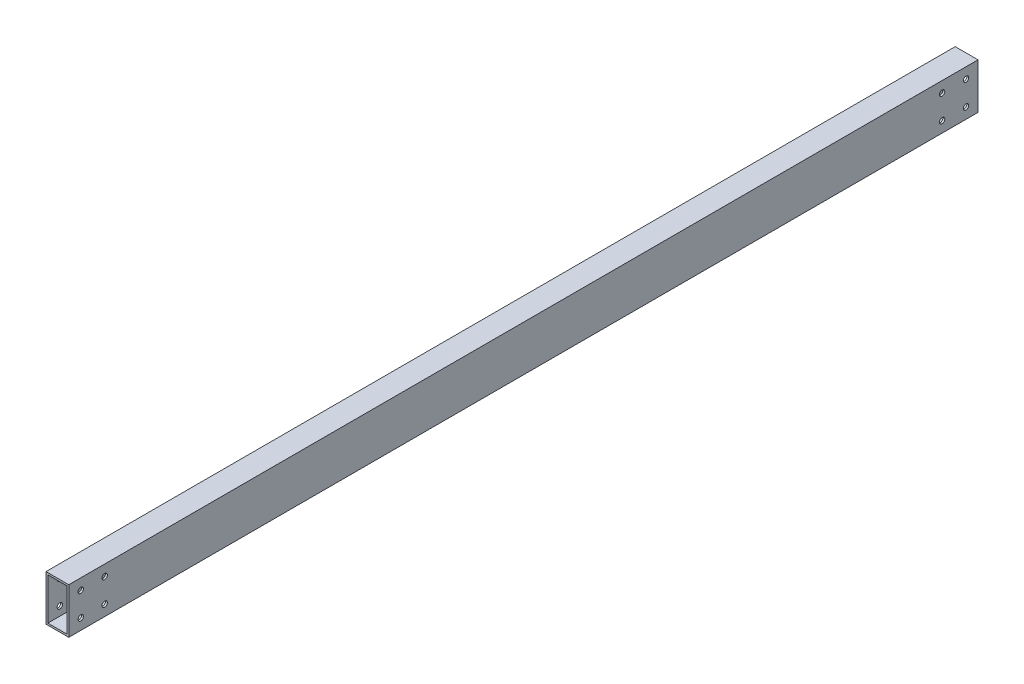
ISO-10303-21;
HEADER;
FILE_DESCRIPTION(('STEP AP214'),'2;1');
FILE_NAME('part.step','',(''),(''),'','','');
FILE_SCHEMA(('AUTOMOTIVE_DESIGN { 1 0 10303 214 1 1 1 1 }'));
ENDSEC;
DATA;
#1=APPLICATION_CONTEXT('core data for automotive mechanical design processes');
#2=APPLICATION_PROTOCOL_DEFINITION('international standard','automotive_design',2000,#1);
#3=PRODUCT_CONTEXT('',#1,'mechanical');
#4=PRODUCT('Part','Part','',(#3));
#5=PRODUCT_RELATED_PRODUCT_CATEGORY('part','',(#4));
#6=PRODUCT_DEFINITION_FORMATION('','',#4);
#7=PRODUCT_DEFINITION_CONTEXT('part definition',#1,'design');
#8=PRODUCT_DEFINITION('design','',#6,#7);
#9=PRODUCT_DEFINITION_SHAPE('','',#8);
#10=(LENGTH_UNIT() NAMED_UNIT(*) SI_UNIT(.MILLI.,.METRE.));
#11=(NAMED_UNIT(*) PLANE_ANGLE_UNIT() SI_UNIT($,.RADIAN.));
#12=(NAMED_UNIT(*) SI_UNIT($,.STERADIAN.) SOLID_ANGLE_UNIT());
#13=UNCERTAINTY_MEASURE_WITH_UNIT(LENGTH_MEASURE(1.E-05),#10,'distance_accuracy_value','');
#14=(GEOMETRIC_REPRESENTATION_CONTEXT(3) GLOBAL_UNCERTAINTY_ASSIGNED_CONTEXT((#13)) GLOBAL_UNIT_ASSIGNED_CONTEXT((#10,
#11,#12)) REPRESENTATION_CONTEXT('',''));
#15=CARTESIAN_POINT('',(0.,0.,0.));
#16=DIRECTION('',(0.,0.,1.));
#17=DIRECTION('',(1.,0.,0.));
#18=AXIS2_PLACEMENT_3D('',#15,#16,#17);
#19=CARTESIAN_POINT('',(19.05,38.1,760.));
#20=DIRECTION('',(-1.,0.,0.));
#21=DIRECTION('',(0.,-1.,0.));
#22=AXIS2_PLACEMENT_3D('',#19,#20,#21);
#23=PLANE('',#22);
#24=CARTESIAN_POINT('',(19.05,20.,-740.));
#25=DIRECTION('',(1.,0.,0.));
#26=DIRECTION('',(0.,0.,-1.));
#27=AXIS2_PLACEMENT_3D('',#24,#25,#26);
#28=CIRCLE('',#27,4.5);
#29=CARTESIAN_POINT('',(19.05,20.,-744.5));
#30=VERTEX_POINT('',#29);
#31=EDGE_CURVE('E252',#30,#30,#28,.T.);
#32=ORIENTED_EDGE('',*,*,#31,.F.);
#33=EDGE_LOOP('',(#32));
#34=FACE_BOUND('',#33,.T.);
#35=CARTESIAN_POINT('',(19.05,-20.,-700.));
#36=DIRECTION('',(1.,0.,0.));
#37=DIRECTION('',(0.,0.,-1.));
#38=AXIS2_PLACEMENT_3D('',#35,#36,#37);
#39=CIRCLE('',#38,4.5);
#40=CARTESIAN_POINT('',(19.05,-20.,-704.5));
#41=VERTEX_POINT('',#40);
#42=EDGE_CURVE('E256',#41,#41,#39,.T.);
#43=ORIENTED_EDGE('',*,*,#42,.F.);
#44=EDGE_LOOP('',(#43));
#45=FACE_BOUND('',#44,.T.);
#46=CARTESIAN_POINT('',(19.05,-20.,740.));
#47=DIRECTION('',(1.,0.,0.));
#48=DIRECTION('',(0.,0.,-1.));
#49=AXIS2_PLACEMENT_3D('',#46,#47,#48);
#50=CIRCLE('',#49,4.5);
#51=CARTESIAN_POINT('',(19.05,-20.,735.5));
#52=VERTEX_POINT('',#51);
#53=EDGE_CURVE('E260',#52,#52,#50,.T.);
#54=ORIENTED_EDGE('',*,*,#53,.F.);
#55=EDGE_LOOP('',(#54));
#56=FACE_BOUND('',#55,.T.);
#57=CARTESIAN_POINT('',(19.05,-20.,700.));
#58=DIRECTION('',(1.,0.,0.));
#59=DIRECTION('',(0.,0.,-1.));
#60=AXIS2_PLACEMENT_3D('',#57,#58,#59);
#61=CIRCLE('',#60,4.5);
#62=CARTESIAN_POINT('',(19.05,-20.,695.5));
#63=VERTEX_POINT('',#62);
#64=EDGE_CURVE('E263',#63,#63,#61,.T.);
#65=ORIENTED_EDGE('',*,*,#64,.F.);
#66=EDGE_LOOP('',(#65));
#67=FACE_BOUND('',#66,.T.);
#68=DIRECTION('',(0.,1.,0.));
#69=VECTOR('',#68,1.);
#70=CARTESIAN_POINT('',(19.05,38.1,-760.));
#71=LINE('',#70,#69);
#72=CARTESIAN_POINT('',(19.05,-38.1,-760.));
#73=VERTEX_POINT('',#72);
#74=CARTESIAN_POINT('',(19.05,38.1,-760.));
#75=VERTEX_POINT('',#74);
#76=EDGE_CURVE('E146',#73,#75,#71,.T.);
#77=ORIENTED_EDGE('',*,*,#76,.T.);
#78=DIRECTION('',(0.,0.,-1.));
#79=VECTOR('',#78,1.);
#80=CARTESIAN_POINT('',(19.05,38.1,760.));
#81=LINE('',#80,#79);
#82=CARTESIAN_POINT('',(19.05,38.1,760.));
#83=VERTEX_POINT('',#82);
#84=EDGE_CURVE('E12',#83,#75,#81,.T.);
#85=ORIENTED_EDGE('',*,*,#84,.F.);
#86=DIRECTION('',(0.,1.,0.));
#87=VECTOR('',#86,1.);
#88=CARTESIAN_POINT('',(19.05,38.1,760.));
#89=LINE('',#88,#87);
#90=CARTESIAN_POINT('',(19.05,-38.1,760.));
#91=VERTEX_POINT('',#90);
#92=EDGE_CURVE('E179',#91,#83,#89,.T.);
#93=ORIENTED_EDGE('',*,*,#92,.F.);
#94=DIRECTION('',(0.,0.,-1.));
#95=VECTOR('',#94,1.);
#96=CARTESIAN_POINT('',(19.05,-38.1,760.));
#97=LINE('',#96,#95);
#98=EDGE_CURVE('E193',#91,#73,#97,.T.);
#99=ORIENTED_EDGE('',*,*,#98,.T.);
#100=EDGE_LOOP('',(#77,#85,#93,#99));
#101=FACE_BOUND('',#100,.T.);
#102=CARTESIAN_POINT('',(19.05,20.,700.));
#103=DIRECTION('',(1.,0.,0.));
#104=DIRECTION('',(0.,0.,-1.));
#105=AXIS2_PLACEMENT_3D('',#102,#103,#104);
#106=CIRCLE('',#105,4.5);
#107=CARTESIAN_POINT('',(19.05,20.,695.5));
#108=VERTEX_POINT('',#107);
#109=EDGE_CURVE('E272',#108,#108,#106,.T.);
#110=ORIENTED_EDGE('',*,*,#109,.F.);
#111=EDGE_LOOP('',(#110));
#112=FACE_BOUND('',#111,.T.);
#113=CARTESIAN_POINT('',(19.05,20.,740.));
#114=DIRECTION('',(1.,0.,0.));
#115=DIRECTION('',(0.,0.,-1.));
#116=AXIS2_PLACEMENT_3D('',#113,#114,#115);
#117=CIRCLE('',#116,4.5);
#118=CARTESIAN_POINT('',(19.05,20.,735.5));
#119=VERTEX_POINT('',#118);
#120=EDGE_CURVE('E288',#119,#119,#117,.T.);
#121=ORIENTED_EDGE('',*,*,#120,.F.);
#122=EDGE_LOOP('',(#121));
#123=FACE_BOUND('',#122,.T.);
#124=CARTESIAN_POINT('',(19.05,20.,-700.));
#125=DIRECTION('',(1.,0.,0.));
#126=DIRECTION('',(0.,0.,-1.));
#127=AXIS2_PLACEMENT_3D('',#124,#125,#126);
#128=CIRCLE('',#127,4.5);
#129=CARTESIAN_POINT('',(19.05,20.,-704.5));
#130=VERTEX_POINT('',#129);
#131=EDGE_CURVE('E334',#130,#130,#128,.T.);
#132=ORIENTED_EDGE('',*,*,#131,.F.);
#133=EDGE_LOOP('',(#132));
#134=FACE_BOUND('',#133,.T.);
#135=CARTESIAN_POINT('',(19.05,-20.,-740.));
#136=DIRECTION('',(1.,0.,0.));
#137=DIRECTION('',(0.,0.,-1.));
#138=AXIS2_PLACEMENT_3D('',#135,#136,#137);
#139=CIRCLE('',#138,4.5);
#140=CARTESIAN_POINT('',(19.05,-20.,-744.5));
#141=VERTEX_POINT('',#140);
#142=EDGE_CURVE('E342',#141,#141,#139,.T.);
#143=ORIENTED_EDGE('',*,*,#142,.F.);
#144=EDGE_LOOP('',(#143));
#145=FACE_BOUND('',#144,.T.);
#146=ADVANCED_FACE('F63',(#34,#45,#56,#67,#101,#112,#123,#134,#145),#23,.F.);
#147=CARTESIAN_POINT('',(0.,0.,760.));
#148=DIRECTION('',(0.,0.,1.));
#149=DIRECTION('',(1.,0.,0.));
#150=AXIS2_PLACEMENT_3D('',#147,#148,#149);
#151=PLANE('',#150);
#152=ORIENTED_EDGE('',*,*,#92,.T.);
#153=DIRECTION('',(-1.,0.,0.));
#154=VECTOR('',#153,1.);
#155=CARTESIAN_POINT('',(-19.05,38.1,760.));
#156=LINE('',#155,#154);
#157=CARTESIAN_POINT('',(-19.05,38.1,760.));
#158=VERTEX_POINT('',#157);
#159=EDGE_CURVE('E183',#83,#158,#156,.T.);
#160=ORIENTED_EDGE('',*,*,#159,.T.);
#161=DIRECTION('',(0.,-1.,0.));
#162=VECTOR('',#161,1.);
#163=CARTESIAN_POINT('',(-19.05,38.1,760.));
#164=LINE('',#163,#162);
#165=CARTESIAN_POINT('',(-19.05,-38.1,760.));
#166=VERTEX_POINT('',#165);
#167=EDGE_CURVE('E187',#158,#166,#164,.T.);
#168=ORIENTED_EDGE('',*,*,#167,.T.);
#169=DIRECTION('',(1.,0.,0.));
#170=VECTOR('',#169,1.);
#171=CARTESIAN_POINT('',(-19.05,-38.1,760.));
#172=LINE('',#171,#170);
#173=EDGE_CURVE('E190',#166,#91,#172,.T.);
#174=ORIENTED_EDGE('',*,*,#173,.T.);
#175=EDGE_LOOP('',(#152,#160,#168,#174));
#176=FACE_BOUND('',#175,.T.);
#177=DIRECTION('',(-1.,0.,0.));
#178=VECTOR('',#177,1.);
#179=CARTESIAN_POINT('',(-19.05,34.925,760.));
#180=LINE('',#179,#178);
#181=CARTESIAN_POINT('',(15.875,34.925,760.));
#182=VERTEX_POINT('',#181);
#183=CARTESIAN_POINT('',(-15.875,34.925,760.));
#184=VERTEX_POINT('',#183);
#185=EDGE_CURVE('E137',#182,#184,#180,.T.);
#186=ORIENTED_EDGE('',*,*,#185,.F.);
#187=DIRECTION('',(0.,1.,0.));
#188=VECTOR('',#187,1.);
#189=CARTESIAN_POINT('',(15.875,38.1,760.));
#190=LINE('',#189,#188);
#191=CARTESIAN_POINT('',(15.875,-34.925,760.));
#192=VERTEX_POINT('',#191);
#193=EDGE_CURVE('E128',#192,#182,#190,.T.);
#194=ORIENTED_EDGE('',*,*,#193,.F.);
#195=DIRECTION('',(1.,0.,0.));
#196=VECTOR('',#195,1.);
#197=CARTESIAN_POINT('',(-19.05,-34.925,760.));
#198=LINE('',#197,#196);
#199=CARTESIAN_POINT('',(-15.875,-34.925,760.));
#200=VERTEX_POINT('',#199);
#201=EDGE_CURVE('E155',#200,#192,#198,.T.);
#202=ORIENTED_EDGE('',*,*,#201,.F.);
#203=DIRECTION('',(0.,-1.,0.));
#204=VECTOR('',#203,1.);
#205=CARTESIAN_POINT('',(-15.875,38.1,760.));
#206=LINE('',#205,#204);
#207=EDGE_CURVE('E151',#184,#200,#206,.T.);
#208=ORIENTED_EDGE('',*,*,#207,.F.);
#209=EDGE_LOOP('',(#186,#194,#202,#208));
#210=FACE_BOUND('',#209,.T.);
#211=ADVANCED_FACE('F150',(#176,#210),#151,.T.);
#212=CARTESIAN_POINT('',(0.,0.,-760.));
#213=DIRECTION('',(0.,0.,1.));
#214=DIRECTION('',(1.,0.,0.));
#215=AXIS2_PLACEMENT_3D('',#212,#213,#214);
#216=PLANE('',#215);
#217=ORIENTED_EDGE('',*,*,#76,.F.);
#218=DIRECTION('',(1.,0.,0.));
#219=VECTOR('',#218,1.);
#220=CARTESIAN_POINT('',(-19.05,-38.1,-760.));
#221=LINE('',#220,#219);
#222=CARTESIAN_POINT('',(-19.05,-38.1,-760.));
#223=VERTEX_POINT('',#222);
#224=EDGE_CURVE('E184',#223,#73,#221,.T.);
#225=ORIENTED_EDGE('',*,*,#224,.F.);
#226=DIRECTION('',(0.,-1.,0.));
#227=VECTOR('',#226,1.);
#228=CARTESIAN_POINT('',(-19.05,38.1,-760.));
#229=LINE('',#228,#227);
#230=CARTESIAN_POINT('',(-19.05,38.1,-760.));
#231=VERTEX_POINT('',#230);
#232=EDGE_CURVE('E200',#231,#223,#229,.T.);
#233=ORIENTED_EDGE('',*,*,#232,.F.);
#234=DIRECTION('',(-1.,0.,0.));
#235=VECTOR('',#234,1.);
#236=CARTESIAN_POINT('',(-19.05,38.1,-760.));
#237=LINE('',#236,#235);
#238=EDGE_CURVE('E197',#75,#231,#237,.T.);
#239=ORIENTED_EDGE('',*,*,#238,.F.);
#240=EDGE_LOOP('',(#217,#225,#233,#239));
#241=FACE_BOUND('',#240,.T.);
#242=DIRECTION('',(0.,1.,0.));
#243=VECTOR('',#242,1.);
#244=CARTESIAN_POINT('',(15.875,38.1,-760.));
#245=LINE('',#244,#243);
#246=CARTESIAN_POINT('',(15.875,-34.925,-760.));
#247=VERTEX_POINT('',#246);
#248=CARTESIAN_POINT('',(15.875,34.925,-760.));
#249=VERTEX_POINT('',#248);
#250=EDGE_CURVE('E86',#247,#249,#245,.T.);
#251=ORIENTED_EDGE('',*,*,#250,.T.);
#252=DIRECTION('',(-1.,0.,0.));
#253=VECTOR('',#252,1.);
#254=CARTESIAN_POINT('',(-19.05,34.925,-760.));
#255=LINE('',#254,#253);
#256=CARTESIAN_POINT('',(-15.875,34.925,-760.));
#257=VERTEX_POINT('',#256);
#258=EDGE_CURVE('E144',#249,#257,#255,.T.);
#259=ORIENTED_EDGE('',*,*,#258,.T.);
#260=DIRECTION('',(0.,-1.,0.));
#261=VECTOR('',#260,1.);
#262=CARTESIAN_POINT('',(-15.875,38.1,-760.));
#263=LINE('',#262,#261);
#264=CARTESIAN_POINT('',(-15.875,-34.925,-760.));
#265=VERTEX_POINT('',#264);
#266=EDGE_CURVE('E166',#257,#265,#263,.T.);
#267=ORIENTED_EDGE('',*,*,#266,.T.);
#268=DIRECTION('',(1.,0.,0.));
#269=VECTOR('',#268,1.);
#270=CARTESIAN_POINT('',(-19.05,-34.925,-760.));
#271=LINE('',#270,#269);
#272=EDGE_CURVE('E138',#265,#247,#271,.T.);
#273=ORIENTED_EDGE('',*,*,#272,.T.);
#274=EDGE_LOOP('',(#251,#259,#267,#273));
#275=FACE_BOUND('',#274,.T.);
#276=ADVANCED_FACE('F223',(#241,#275),#216,.F.);
#277=CARTESIAN_POINT('',(-19.05,38.1,760.));
#278=DIRECTION('',(0.,-1.,0.));
#279=DIRECTION('',(0.,0.,-1.));
#280=AXIS2_PLACEMENT_3D('',#277,#278,#279);
#281=PLANE('',#280);
#282=ORIENTED_EDGE('',*,*,#238,.T.);
#283=DIRECTION('',(0.,0.,-1.));
#284=VECTOR('',#283,1.);
#285=CARTESIAN_POINT('',(-19.05,38.1,760.));
#286=LINE('',#285,#284);
#287=EDGE_CURVE('E71',#158,#231,#286,.T.);
#288=ORIENTED_EDGE('',*,*,#287,.F.);
#289=ORIENTED_EDGE('',*,*,#159,.F.);
#290=ORIENTED_EDGE('',*,*,#84,.T.);
#291=EDGE_LOOP('',(#282,#288,#289,#290));
#292=FACE_BOUND('',#291,.T.);
#293=ADVANCED_FACE('F234',(#292),#281,.F.);
#294=CARTESIAN_POINT('',(-19.05,38.1,760.));
#295=DIRECTION('',(1.,0.,0.));
#296=DIRECTION('',(0.,1.,0.));
#297=AXIS2_PLACEMENT_3D('',#294,#295,#296);
#298=PLANE('',#297);
#299=CARTESIAN_POINT('',(-19.05,20.,-740.));
#300=DIRECTION('',(1.,0.,0.));
#301=DIRECTION('',(0.,1.,0.));
#302=AXIS2_PLACEMENT_3D('',#299,#300,#301);
#303=CIRCLE('',#302,4.5);
#304=CARTESIAN_POINT('',(-19.05,24.5,-740.));
#305=VERTEX_POINT('',#304);
#306=EDGE_CURVE('E376',#305,#305,#303,.T.);
#307=ORIENTED_EDGE('',*,*,#306,.T.);
#308=EDGE_LOOP('',(#307));
#309=FACE_BOUND('',#308,.T.);
#310=CARTESIAN_POINT('',(-19.05,-20.,-740.));
#311=DIRECTION('',(1.,0.,0.));
#312=DIRECTION('',(0.,1.,0.));
#313=AXIS2_PLACEMENT_3D('',#310,#311,#312);
#314=CIRCLE('',#313,4.5);
#315=CARTESIAN_POINT('',(-19.05,-15.5,-740.));
#316=VERTEX_POINT('',#315);
#317=EDGE_CURVE('E368',#316,#316,#314,.T.);
#318=ORIENTED_EDGE('',*,*,#317,.T.);
#319=EDGE_LOOP('',(#318));
#320=FACE_BOUND('',#319,.T.);
#321=CARTESIAN_POINT('',(-19.05,20.,-700.));
#322=DIRECTION('',(1.,0.,0.));
#323=DIRECTION('',(0.,1.,0.));
#324=AXIS2_PLACEMENT_3D('',#321,#322,#323);
#325=CIRCLE('',#324,4.5);
#326=CARTESIAN_POINT('',(-19.05,24.5,-700.));
#327=VERTEX_POINT('',#326);
#328=EDGE_CURVE('E360',#327,#327,#325,.T.);
#329=ORIENTED_EDGE('',*,*,#328,.T.);
#330=EDGE_LOOP('',(#329));
#331=FACE_BOUND('',#330,.T.);
#332=CARTESIAN_POINT('',(-19.05,-20.,-700.));
#333=DIRECTION('',(1.,0.,0.));
#334=DIRECTION('',(0.,1.,0.));
#335=AXIS2_PLACEMENT_3D('',#332,#333,#334);
#336=CIRCLE('',#335,4.5);
#337=CARTESIAN_POINT('',(-19.05,-15.5,-700.));
#338=VERTEX_POINT('',#337);
#339=EDGE_CURVE('E352',#338,#338,#336,.T.);
#340=ORIENTED_EDGE('',*,*,#339,.T.);
#341=EDGE_LOOP('',(#340));
#342=FACE_BOUND('',#341,.T.);
#343=CARTESIAN_POINT('',(-19.05,20.,740.));
#344=DIRECTION('',(1.,0.,0.));
#345=DIRECTION('',(0.,1.,0.));
#346=AXIS2_PLACEMENT_3D('',#343,#344,#345);
#347=CIRCLE('',#346,4.5);
#348=CARTESIAN_POINT('',(-19.05,24.5,740.));
#349=VERTEX_POINT('',#348);
#350=EDGE_CURVE('E316',#349,#349,#347,.T.);
#351=ORIENTED_EDGE('',*,*,#350,.T.);
#352=EDGE_LOOP('',(#351));
#353=FACE_BOUND('',#352,.T.);
#354=CARTESIAN_POINT('',(-19.05,-20.,740.));
#355=DIRECTION('',(1.,0.,0.));
#356=DIRECTION('',(0.,1.,0.));
#357=AXIS2_PLACEMENT_3D('',#354,#355,#356);
#358=CIRCLE('',#357,4.5);
#359=CARTESIAN_POINT('',(-19.05,-15.5,740.));
#360=VERTEX_POINT('',#359);
#361=EDGE_CURVE('E308',#360,#360,#358,.T.);
#362=ORIENTED_EDGE('',*,*,#361,.T.);
#363=EDGE_LOOP('',(#362));
#364=FACE_BOUND('',#363,.T.);
#365=CARTESIAN_POINT('',(-19.05,20.,700.));
#366=DIRECTION('',(1.,0.,0.));
#367=DIRECTION('',(0.,1.,0.));
#368=AXIS2_PLACEMENT_3D('',#365,#366,#367);
#369=CIRCLE('',#368,4.5);
#370=CARTESIAN_POINT('',(-19.05,24.5,700.));
#371=VERTEX_POINT('',#370);
#372=EDGE_CURVE('E300',#371,#371,#369,.T.);
#373=ORIENTED_EDGE('',*,*,#372,.T.);
#374=EDGE_LOOP('',(#373));
#375=FACE_BOUND('',#374,.T.);
#376=CARTESIAN_POINT('',(-19.05,-20.,700.));
#377=DIRECTION('',(1.,0.,0.));
#378=DIRECTION('',(0.,1.,0.));
#379=AXIS2_PLACEMENT_3D('',#376,#377,#378);
#380=CIRCLE('',#379,4.5);
#381=CARTESIAN_POINT('',(-19.05,-15.5,700.));
#382=VERTEX_POINT('',#381);
#383=EDGE_CURVE('E292',#382,#382,#380,.T.);
#384=ORIENTED_EDGE('',*,*,#383,.T.);
#385=EDGE_LOOP('',(#384));
#386=FACE_BOUND('',#385,.T.);
#387=ORIENTED_EDGE('',*,*,#232,.T.);
#388=DIRECTION('',(0.,0.,-1.));
#389=VECTOR('',#388,1.);
#390=CARTESIAN_POINT('',(-19.05,-38.1,760.));
#391=LINE('',#390,#389);
#392=EDGE_CURVE('E208',#166,#223,#391,.T.);
#393=ORIENTED_EDGE('',*,*,#392,.F.);
#394=ORIENTED_EDGE('',*,*,#167,.F.);
#395=ORIENTED_EDGE('',*,*,#287,.T.);
#396=EDGE_LOOP('',(#387,#393,#394,#395));
#397=FACE_BOUND('',#396,.T.);
#398=ADVANCED_FACE('F217',(#309,#320,#331,#342,#353,#364,#375,#386,#397),#298,.F.);
#399=CARTESIAN_POINT('',(-19.05,-38.1,760.));
#400=DIRECTION('',(0.,1.,0.));
#401=DIRECTION('',(0.,0.,1.));
#402=AXIS2_PLACEMENT_3D('',#399,#400,#401);
#403=PLANE('',#402);
#404=ORIENTED_EDGE('',*,*,#224,.T.);
#405=ORIENTED_EDGE('',*,*,#98,.F.);
#406=ORIENTED_EDGE('',*,*,#173,.F.);
#407=ORIENTED_EDGE('',*,*,#392,.T.);
#408=EDGE_LOOP('',(#404,#405,#406,#407));
#409=FACE_BOUND('',#408,.T.);
#410=ADVANCED_FACE('F227',(#409),#403,.F.);
#411=CARTESIAN_POINT('',(15.875,38.1,760.));
#412=DIRECTION('',(-1.,0.,0.));
#413=DIRECTION('',(0.,-1.,0.));
#414=AXIS2_PLACEMENT_3D('',#411,#412,#413);
#415=PLANE('',#414);
#416=CARTESIAN_POINT('',(15.875,20.,-740.));
#417=DIRECTION('',(-1.,0.,0.));
#418=DIRECTION('',(0.,-1.,0.));
#419=AXIS2_PLACEMENT_3D('',#416,#417,#418);
#420=CIRCLE('',#419,4.5);
#421=CARTESIAN_POINT('',(15.875,15.5,-740.));
#422=VERTEX_POINT('',#421);
#423=EDGE_CURVE('E346',#422,#422,#420,.T.);
#424=ORIENTED_EDGE('',*,*,#423,.F.);
#425=EDGE_LOOP('',(#424));
#426=FACE_BOUND('',#425,.T.);
#427=CARTESIAN_POINT('',(15.875,-20.,-740.));
#428=DIRECTION('',(-1.,0.,0.));
#429=DIRECTION('',(0.,-1.,0.));
#430=AXIS2_PLACEMENT_3D('',#427,#428,#429);
#431=CIRCLE('',#430,4.5);
#432=CARTESIAN_POINT('',(15.875,-24.5,-740.));
#433=VERTEX_POINT('',#432);
#434=EDGE_CURVE('E338',#433,#433,#431,.T.);
#435=ORIENTED_EDGE('',*,*,#434,.F.);
#436=EDGE_LOOP('',(#435));
#437=FACE_BOUND('',#436,.T.);
#438=CARTESIAN_POINT('',(15.875,20.,-700.));
#439=DIRECTION('',(-1.,0.,0.));
#440=DIRECTION('',(0.,-1.,0.));
#441=AXIS2_PLACEMENT_3D('',#438,#439,#440);
#442=CIRCLE('',#441,4.5);
#443=CARTESIAN_POINT('',(15.875,15.5,-700.));
#444=VERTEX_POINT('',#443);
#445=EDGE_CURVE('E330',#444,#444,#442,.T.);
#446=ORIENTED_EDGE('',*,*,#445,.F.);
#447=EDGE_LOOP('',(#446));
#448=FACE_BOUND('',#447,.T.);
#449=CARTESIAN_POINT('',(15.875,-20.,-700.));
#450=DIRECTION('',(-1.,0.,0.));
#451=DIRECTION('',(0.,-1.,0.));
#452=AXIS2_PLACEMENT_3D('',#449,#450,#451);
#453=CIRCLE('',#452,4.5);
#454=CARTESIAN_POINT('',(15.875,-24.5,-700.));
#455=VERTEX_POINT('',#454);
#456=EDGE_CURVE('E324',#455,#455,#453,.T.);
#457=ORIENTED_EDGE('',*,*,#456,.F.);
#458=EDGE_LOOP('',(#457));
#459=FACE_BOUND('',#458,.T.);
#460=CARTESIAN_POINT('',(15.875,20.,740.));
#461=DIRECTION('',(-1.,0.,0.));
#462=DIRECTION('',(0.,-1.,0.));
#463=AXIS2_PLACEMENT_3D('',#460,#461,#462);
#464=CIRCLE('',#463,4.5);
#465=CARTESIAN_POINT('',(15.875,15.5,740.));
#466=VERTEX_POINT('',#465);
#467=EDGE_CURVE('E284',#466,#466,#464,.T.);
#468=ORIENTED_EDGE('',*,*,#467,.F.);
#469=EDGE_LOOP('',(#468));
#470=FACE_BOUND('',#469,.T.);
#471=CARTESIAN_POINT('',(15.875,-20.,740.));
#472=DIRECTION('',(-1.,0.,0.));
#473=DIRECTION('',(0.,-1.,0.));
#474=AXIS2_PLACEMENT_3D('',#471,#472,#473);
#475=CIRCLE('',#474,4.5);
#476=CARTESIAN_POINT('',(15.875,-24.5,740.));
#477=VERTEX_POINT('',#476);
#478=EDGE_CURVE('E278',#477,#477,#475,.T.);
#479=ORIENTED_EDGE('',*,*,#478,.F.);
#480=EDGE_LOOP('',(#479));
#481=FACE_BOUND('',#480,.T.);
#482=CARTESIAN_POINT('',(15.875,20.,700.));
#483=DIRECTION('',(-1.,0.,0.));
#484=DIRECTION('',(0.,-1.,0.));
#485=AXIS2_PLACEMENT_3D('',#482,#483,#484);
#486=CIRCLE('',#485,4.5);
#487=CARTESIAN_POINT('',(15.875,15.5,700.));
#488=VERTEX_POINT('',#487);
#489=EDGE_CURVE('E266',#488,#488,#486,.T.);
#490=ORIENTED_EDGE('',*,*,#489,.F.);
#491=EDGE_LOOP('',(#490));
#492=FACE_BOUND('',#491,.T.);
#493=CARTESIAN_POINT('',(15.875,-20.,700.));
#494=DIRECTION('',(-1.,0.,0.));
#495=DIRECTION('',(0.,-1.,0.));
#496=AXIS2_PLACEMENT_3D('',#493,#494,#495);
#497=CIRCLE('',#496,4.5);
#498=CARTESIAN_POINT('',(15.875,-24.5,700.));
#499=VERTEX_POINT('',#498);
#500=EDGE_CURVE('E163',#499,#499,#497,.T.);
#501=ORIENTED_EDGE('',*,*,#500,.F.);
#502=EDGE_LOOP('',(#501));
#503=FACE_BOUND('',#502,.T.);
#504=ORIENTED_EDGE('',*,*,#250,.F.);
#505=DIRECTION('',(0.,0.,-1.));
#506=VECTOR('',#505,1.);
#507=CARTESIAN_POINT('',(15.875,-34.925,760.));
#508=LINE('',#507,#506);
#509=EDGE_CURVE('E132',#192,#247,#508,.T.);
#510=ORIENTED_EDGE('',*,*,#509,.F.);
#511=ORIENTED_EDGE('',*,*,#193,.T.);
#512=DIRECTION('',(0.,0.,-1.));
#513=VECTOR('',#512,1.);
#514=CARTESIAN_POINT('',(15.875,34.925,760.));
#515=LINE('',#514,#513);
#516=EDGE_CURVE('E131',#182,#249,#515,.T.);
#517=ORIENTED_EDGE('',*,*,#516,.T.);
#518=EDGE_LOOP('',(#504,#510,#511,#517));
#519=FACE_BOUND('',#518,.T.);
#520=ADVANCED_FACE('F130',(#426,#437,#448,#459,#470,#481,#492,#503,#519),#415,.T.);
#521=CARTESIAN_POINT('',(-19.05,34.925,760.));
#522=DIRECTION('',(0.,-1.,0.));
#523=DIRECTION('',(0.,0.,-1.));
#524=AXIS2_PLACEMENT_3D('',#521,#522,#523);
#525=PLANE('',#524);
#526=ORIENTED_EDGE('',*,*,#258,.F.);
#527=ORIENTED_EDGE('',*,*,#516,.F.);
#528=ORIENTED_EDGE('',*,*,#185,.T.);
#529=DIRECTION('',(0.,0.,-1.));
#530=VECTOR('',#529,1.);
#531=CARTESIAN_POINT('',(-15.875,34.925,760.));
#532=LINE('',#531,#530);
#533=EDGE_CURVE('E147',#184,#257,#532,.T.);
#534=ORIENTED_EDGE('',*,*,#533,.T.);
#535=EDGE_LOOP('',(#526,#527,#528,#534));
#536=FACE_BOUND('',#535,.T.);
#537=ADVANCED_FACE('F141',(#536),#525,.T.);
#538=CARTESIAN_POINT('',(-15.875,38.1,760.));
#539=DIRECTION('',(1.,0.,0.));
#540=DIRECTION('',(0.,1.,0.));
#541=AXIS2_PLACEMENT_3D('',#538,#539,#540);
#542=PLANE('',#541);
#543=CARTESIAN_POINT('',(-15.875,20.,-740.));
#544=DIRECTION('',(1.,0.,0.));
#545=DIRECTION('',(0.,0.,-1.));
#546=AXIS2_PLACEMENT_3D('',#543,#544,#545);
#547=CIRCLE('',#546,4.5);
#548=CARTESIAN_POINT('',(-15.875,20.,-744.5));
#549=VERTEX_POINT('',#548);
#550=EDGE_CURVE('E380',#549,#549,#547,.T.);
#551=ORIENTED_EDGE('',*,*,#550,.F.);
#552=EDGE_LOOP('',(#551));
#553=FACE_BOUND('',#552,.T.);
#554=CARTESIAN_POINT('',(-15.875,-20.,-740.));
#555=DIRECTION('',(1.,0.,0.));
#556=DIRECTION('',(0.,0.,-1.));
#557=AXIS2_PLACEMENT_3D('',#554,#555,#556);
#558=CIRCLE('',#557,4.5);
#559=CARTESIAN_POINT('',(-15.875,-20.,-744.5));
#560=VERTEX_POINT('',#559);
#561=EDGE_CURVE('E372',#560,#560,#558,.T.);
#562=ORIENTED_EDGE('',*,*,#561,.F.);
#563=EDGE_LOOP('',(#562));
#564=FACE_BOUND('',#563,.T.);
#565=CARTESIAN_POINT('',(-15.875,20.,-700.));
#566=DIRECTION('',(1.,0.,0.));
#567=DIRECTION('',(0.,0.,-1.));
#568=AXIS2_PLACEMENT_3D('',#565,#566,#567);
#569=CIRCLE('',#568,4.5);
#570=CARTESIAN_POINT('',(-15.875,20.,-704.5));
#571=VERTEX_POINT('',#570);
#572=EDGE_CURVE('E364',#571,#571,#569,.T.);
#573=ORIENTED_EDGE('',*,*,#572,.F.);
#574=EDGE_LOOP('',(#573));
#575=FACE_BOUND('',#574,.T.);
#576=CARTESIAN_POINT('',(-15.875,-20.,-700.));
#577=DIRECTION('',(1.,0.,0.));
#578=DIRECTION('',(0.,0.,-1.));
#579=AXIS2_PLACEMENT_3D('',#576,#577,#578);
#580=CIRCLE('',#579,4.5);
#581=CARTESIAN_POINT('',(-15.875,-20.,-704.5));
#582=VERTEX_POINT('',#581);
#583=EDGE_CURVE('E356',#582,#582,#580,.T.);
#584=ORIENTED_EDGE('',*,*,#583,.F.);
#585=EDGE_LOOP('',(#584));
#586=FACE_BOUND('',#585,.T.);
#587=CARTESIAN_POINT('',(-15.875,20.,740.));
#588=DIRECTION('',(1.,0.,0.));
#589=DIRECTION('',(0.,0.,-1.));
#590=AXIS2_PLACEMENT_3D('',#587,#588,#589);
#591=CIRCLE('',#590,4.5);
#592=CARTESIAN_POINT('',(-15.875,20.,735.5));
#593=VERTEX_POINT('',#592);
#594=EDGE_CURVE('E320',#593,#593,#591,.T.);
#595=ORIENTED_EDGE('',*,*,#594,.F.);
#596=EDGE_LOOP('',(#595));
#597=FACE_BOUND('',#596,.T.);
#598=CARTESIAN_POINT('',(-15.875,-20.,740.));
#599=DIRECTION('',(1.,0.,0.));
#600=DIRECTION('',(0.,0.,-1.));
#601=AXIS2_PLACEMENT_3D('',#598,#599,#600);
#602=CIRCLE('',#601,4.5);
#603=CARTESIAN_POINT('',(-15.875,-20.,735.5));
#604=VERTEX_POINT('',#603);
#605=EDGE_CURVE('E312',#604,#604,#602,.T.);
#606=ORIENTED_EDGE('',*,*,#605,.F.);
#607=EDGE_LOOP('',(#606));
#608=FACE_BOUND('',#607,.T.);
#609=CARTESIAN_POINT('',(-15.875,20.,700.));
#610=DIRECTION('',(1.,0.,0.));
#611=DIRECTION('',(0.,0.,-1.));
#612=AXIS2_PLACEMENT_3D('',#609,#610,#611);
#613=CIRCLE('',#612,4.5);
#614=CARTESIAN_POINT('',(-15.875,20.,695.5));
#615=VERTEX_POINT('',#614);
#616=EDGE_CURVE('E304',#615,#615,#613,.T.);
#617=ORIENTED_EDGE('',*,*,#616,.F.);
#618=EDGE_LOOP('',(#617));
#619=FACE_BOUND('',#618,.T.);
#620=CARTESIAN_POINT('',(-15.875,-20.,700.));
#621=DIRECTION('',(1.,0.,0.));
#622=DIRECTION('',(0.,0.,-1.));
#623=AXIS2_PLACEMENT_3D('',#620,#621,#622);
#624=CIRCLE('',#623,4.5);
#625=CARTESIAN_POINT('',(-15.875,-20.,695.5));
#626=VERTEX_POINT('',#625);
#627=EDGE_CURVE('E296',#626,#626,#624,.T.);
#628=ORIENTED_EDGE('',*,*,#627,.F.);
#629=EDGE_LOOP('',(#628));
#630=FACE_BOUND('',#629,.T.);
#631=ORIENTED_EDGE('',*,*,#266,.F.);
#632=ORIENTED_EDGE('',*,*,#533,.F.);
#633=ORIENTED_EDGE('',*,*,#207,.T.);
#634=DIRECTION('',(0.,0.,-1.));
#635=VECTOR('',#634,1.);
#636=CARTESIAN_POINT('',(-15.875,-34.925,760.));
#637=LINE('',#636,#635);
#638=EDGE_CURVE('E78',#200,#265,#637,.T.);
#639=ORIENTED_EDGE('',*,*,#638,.T.);
#640=EDGE_LOOP('',(#631,#632,#633,#639));
#641=FACE_BOUND('',#640,.T.);
#642=ADVANCED_FACE('F387',(#553,#564,#575,#586,#597,#608,#619,#630,#641),#542,.T.);
#643=CARTESIAN_POINT('',(-19.05,-34.925,760.));
#644=DIRECTION('',(0.,1.,0.));
#645=DIRECTION('',(0.,0.,1.));
#646=AXIS2_PLACEMENT_3D('',#643,#644,#645);
#647=PLANE('',#646);
#648=ORIENTED_EDGE('',*,*,#272,.F.);
#649=ORIENTED_EDGE('',*,*,#638,.F.);
#650=ORIENTED_EDGE('',*,*,#201,.T.);
#651=ORIENTED_EDGE('',*,*,#509,.T.);
#652=EDGE_LOOP('',(#648,#649,#650,#651));
#653=FACE_BOUND('',#652,.T.);
#654=ADVANCED_FACE('F390',(#653),#647,.T.);
#655=CARTESIAN_POINT('',(19.05,-20.,700.));
#656=DIRECTION('',(1.,0.,0.));
#657=DIRECTION('',(0.,0.,-1.));
#658=AXIS2_PLACEMENT_3D('',#655,#656,#657);
#659=CYLINDRICAL_SURFACE('',#658,4.5);
#660=ORIENTED_EDGE('',*,*,#64,.T.);
#661=EDGE_LOOP('',(#660));
#662=FACE_BOUND('',#661,.T.);
#663=ORIENTED_EDGE('',*,*,#500,.T.);
#664=EDGE_LOOP('',(#663));
#665=FACE_BOUND('',#664,.T.);
#666=ADVANCED_FACE('F408',(#662,#665),#659,.F.);
#667=CARTESIAN_POINT('',(19.05,20.,700.));
#668=DIRECTION('',(1.,0.,0.));
#669=DIRECTION('',(0.,0.,-1.));
#670=AXIS2_PLACEMENT_3D('',#667,#668,#669);
#671=CYLINDRICAL_SURFACE('',#670,4.5);
#672=ORIENTED_EDGE('',*,*,#109,.T.);
#673=EDGE_LOOP('',(#672));
#674=FACE_BOUND('',#673,.T.);
#675=ORIENTED_EDGE('',*,*,#489,.T.);
#676=EDGE_LOOP('',(#675));
#677=FACE_BOUND('',#676,.T.);
#678=ADVANCED_FACE('F413',(#674,#677),#671,.F.);
#679=CARTESIAN_POINT('',(19.05,-20.,740.));
#680=DIRECTION('',(1.,0.,0.));
#681=DIRECTION('',(0.,0.,-1.));
#682=AXIS2_PLACEMENT_3D('',#679,#680,#681);
#683=CYLINDRICAL_SURFACE('',#682,4.5);
#684=ORIENTED_EDGE('',*,*,#53,.T.);
#685=EDGE_LOOP('',(#684));
#686=FACE_BOUND('',#685,.T.);
#687=ORIENTED_EDGE('',*,*,#478,.T.);
#688=EDGE_LOOP('',(#687));
#689=FACE_BOUND('',#688,.T.);
#690=ADVANCED_FACE('F545',(#686,#689),#683,.F.);
#691=CARTESIAN_POINT('',(19.05,20.,740.));
#692=DIRECTION('',(1.,0.,0.));
#693=DIRECTION('',(0.,0.,-1.));
#694=AXIS2_PLACEMENT_3D('',#691,#692,#693);
#695=CYLINDRICAL_SURFACE('',#694,4.5);
#696=ORIENTED_EDGE('',*,*,#120,.T.);
#697=EDGE_LOOP('',(#696));
#698=FACE_BOUND('',#697,.T.);
#699=ORIENTED_EDGE('',*,*,#467,.T.);
#700=EDGE_LOOP('',(#699));
#701=FACE_BOUND('',#700,.T.);
#702=ADVANCED_FACE('F541',(#698,#701),#695,.F.);
#703=CARTESIAN_POINT('',(-15.875,-20.,700.));
#704=DIRECTION('',(1.,0.,0.));
#705=DIRECTION('',(0.,0.,-1.));
#706=AXIS2_PLACEMENT_3D('',#703,#704,#705);
#707=CYLINDRICAL_SURFACE('',#706,4.5);
#708=ORIENTED_EDGE('',*,*,#383,.F.);
#709=EDGE_LOOP('',(#708));
#710=FACE_BOUND('',#709,.T.);
#711=ORIENTED_EDGE('',*,*,#627,.T.);
#712=EDGE_LOOP('',(#711));
#713=FACE_BOUND('',#712,.T.);
#714=ADVANCED_FACE('F537',(#710,#713),#707,.F.);
#715=CARTESIAN_POINT('',(-15.875,20.,700.));
#716=DIRECTION('',(1.,0.,0.));
#717=DIRECTION('',(0.,0.,-1.));
#718=AXIS2_PLACEMENT_3D('',#715,#716,#717);
#719=CYLINDRICAL_SURFACE('',#718,4.5);
#720=ORIENTED_EDGE('',*,*,#372,.F.);
#721=EDGE_LOOP('',(#720));
#722=FACE_BOUND('',#721,.T.);
#723=ORIENTED_EDGE('',*,*,#616,.T.);
#724=EDGE_LOOP('',(#723));
#725=FACE_BOUND('',#724,.T.);
#726=ADVANCED_FACE('F533',(#722,#725),#719,.F.);
#727=CARTESIAN_POINT('',(-15.875,-20.,740.));
#728=DIRECTION('',(1.,0.,0.));
#729=DIRECTION('',(0.,0.,-1.));
#730=AXIS2_PLACEMENT_3D('',#727,#728,#729);
#731=CYLINDRICAL_SURFACE('',#730,4.5);
#732=ORIENTED_EDGE('',*,*,#361,.F.);
#733=EDGE_LOOP('',(#732));
#734=FACE_BOUND('',#733,.T.);
#735=ORIENTED_EDGE('',*,*,#605,.T.);
#736=EDGE_LOOP('',(#735));
#737=FACE_BOUND('',#736,.T.);
#738=ADVANCED_FACE('F529',(#734,#737),#731,.F.);
#739=CARTESIAN_POINT('',(-15.875,20.,740.));
#740=DIRECTION('',(1.,0.,0.));
#741=DIRECTION('',(0.,0.,-1.));
#742=AXIS2_PLACEMENT_3D('',#739,#740,#741);
#743=CYLINDRICAL_SURFACE('',#742,4.5);
#744=ORIENTED_EDGE('',*,*,#350,.F.);
#745=EDGE_LOOP('',(#744));
#746=FACE_BOUND('',#745,.T.);
#747=ORIENTED_EDGE('',*,*,#594,.T.);
#748=EDGE_LOOP('',(#747));
#749=FACE_BOUND('',#748,.T.);
#750=ADVANCED_FACE('F451',(#746,#749),#743,.F.);
#751=CARTESIAN_POINT('',(19.05,-20.,-700.));
#752=DIRECTION('',(1.,0.,0.));
#753=DIRECTION('',(0.,0.,-1.));
#754=AXIS2_PLACEMENT_3D('',#751,#752,#753);
#755=CYLINDRICAL_SURFACE('',#754,4.5);
#756=ORIENTED_EDGE('',*,*,#42,.T.);
#757=EDGE_LOOP('',(#756));
#758=FACE_BOUND('',#757,.T.);
#759=ORIENTED_EDGE('',*,*,#456,.T.);
#760=EDGE_LOOP('',(#759));
#761=FACE_BOUND('',#760,.T.);
#762=ADVANCED_FACE('F445',(#758,#761),#755,.F.);
#763=CARTESIAN_POINT('',(19.05,20.,-700.));
#764=DIRECTION('',(1.,0.,0.));
#765=DIRECTION('',(0.,0.,-1.));
#766=AXIS2_PLACEMENT_3D('',#763,#764,#765);
#767=CYLINDRICAL_SURFACE('',#766,4.5);
#768=ORIENTED_EDGE('',*,*,#131,.T.);
#769=EDGE_LOOP('',(#768));
#770=FACE_BOUND('',#769,.T.);
#771=ORIENTED_EDGE('',*,*,#445,.T.);
#772=EDGE_LOOP('',(#771));
#773=FACE_BOUND('',#772,.T.);
#774=ADVANCED_FACE('F450',(#770,#773),#767,.F.);
#775=CARTESIAN_POINT('',(19.05,-20.,-740.));
#776=DIRECTION('',(1.,0.,0.));
#777=DIRECTION('',(0.,0.,-1.));
#778=AXIS2_PLACEMENT_3D('',#775,#776,#777);
#779=CYLINDRICAL_SURFACE('',#778,4.5);
#780=ORIENTED_EDGE('',*,*,#142,.T.);
#781=EDGE_LOOP('',(#780));
#782=FACE_BOUND('',#781,.T.);
#783=ORIENTED_EDGE('',*,*,#434,.T.);
#784=EDGE_LOOP('',(#783));
#785=FACE_BOUND('',#784,.T.);
#786=ADVANCED_FACE('F463',(#782,#785),#779,.F.);
#787=CARTESIAN_POINT('',(19.05,20.,-740.));
#788=DIRECTION('',(1.,0.,0.));
#789=DIRECTION('',(0.,0.,-1.));
#790=AXIS2_PLACEMENT_3D('',#787,#788,#789);
#791=CYLINDRICAL_SURFACE('',#790,4.5);
#792=ORIENTED_EDGE('',*,*,#31,.T.);
#793=EDGE_LOOP('',(#792));
#794=FACE_BOUND('',#793,.T.);
#795=ORIENTED_EDGE('',*,*,#423,.T.);
#796=EDGE_LOOP('',(#795));
#797=FACE_BOUND('',#796,.T.);
#798=ADVANCED_FACE('F473',(#794,#797),#791,.F.);
#799=CARTESIAN_POINT('',(-15.875,-20.,-700.));
#800=DIRECTION('',(1.,0.,0.));
#801=DIRECTION('',(0.,0.,-1.));
#802=AXIS2_PLACEMENT_3D('',#799,#800,#801);
#803=CYLINDRICAL_SURFACE('',#802,4.5);
#804=ORIENTED_EDGE('',*,*,#339,.F.);
#805=EDGE_LOOP('',(#804));
#806=FACE_BOUND('',#805,.T.);
#807=ORIENTED_EDGE('',*,*,#583,.T.);
#808=EDGE_LOOP('',(#807));
#809=FACE_BOUND('',#808,.T.);
#810=ADVANCED_FACE('F483',(#806,#809),#803,.F.);
#811=CARTESIAN_POINT('',(-15.875,20.,-700.));
#812=DIRECTION('',(1.,0.,0.));
#813=DIRECTION('',(0.,0.,-1.));
#814=AXIS2_PLACEMENT_3D('',#811,#812,#813);
#815=CYLINDRICAL_SURFACE('',#814,4.5);
#816=ORIENTED_EDGE('',*,*,#328,.F.);
#817=EDGE_LOOP('',(#816));
#818=FACE_BOUND('',#817,.T.);
#819=ORIENTED_EDGE('',*,*,#572,.T.);
#820=EDGE_LOOP('',(#819));
#821=FACE_BOUND('',#820,.T.);
#822=ADVANCED_FACE('F493',(#818,#821),#815,.F.);
#823=CARTESIAN_POINT('',(-15.875,-20.,-740.));
#824=DIRECTION('',(1.,0.,0.));
#825=DIRECTION('',(0.,0.,-1.));
#826=AXIS2_PLACEMENT_3D('',#823,#824,#825);
#827=CYLINDRICAL_SURFACE('',#826,4.5);
#828=ORIENTED_EDGE('',*,*,#317,.F.);
#829=EDGE_LOOP('',(#828));
#830=FACE_BOUND('',#829,.T.);
#831=ORIENTED_EDGE('',*,*,#561,.T.);
#832=EDGE_LOOP('',(#831));
#833=FACE_BOUND('',#832,.T.);
#834=ADVANCED_FACE('F503',(#830,#833),#827,.F.);
#835=CARTESIAN_POINT('',(-15.875,20.,-740.));
#836=DIRECTION('',(1.,0.,0.));
#837=DIRECTION('',(0.,0.,-1.));
#838=AXIS2_PLACEMENT_3D('',#835,#836,#837);
#839=CYLINDRICAL_SURFACE('',#838,4.5);
#840=ORIENTED_EDGE('',*,*,#306,.F.);
#841=EDGE_LOOP('',(#840));
#842=FACE_BOUND('',#841,.T.);
#843=ORIENTED_EDGE('',*,*,#550,.T.);
#844=EDGE_LOOP('',(#843));
#845=FACE_BOUND('',#844,.T.);
#846=ADVANCED_FACE('F385',(#842,#845),#839,.F.);
#847=CLOSED_SHELL('',(#146,#211,#276,#293,#398,#410,#520,#537,#642,#654,#666,#678,#690,#702,
#714,#726,#738,#750,#762,#774,#786,#798,#810,#822,#834,#846));
#848=MANIFOLD_SOLID_BREP('B2',#847);
#849=ADVANCED_BREP_SHAPE_REPRESENTATION('',(#18,#848),#14);
#850=SHAPE_DEFINITION_REPRESENTATION(#9,#849);
ENDSEC;
END-ISO-10303-21;
